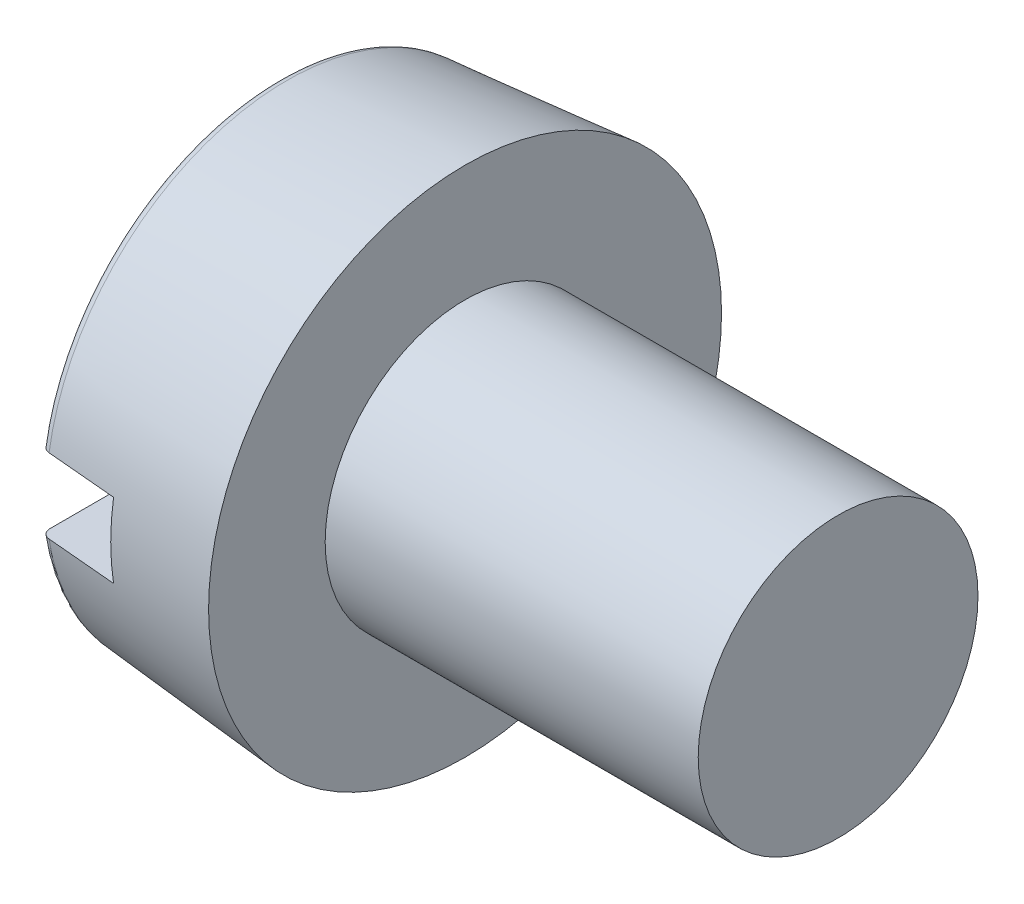
ISO-10303-21;
HEADER;
FILE_DESCRIPTION(('STEP AP214'),'2;1');
FILE_NAME('part.step','',(''),(''),'','','');
FILE_SCHEMA(('AUTOMOTIVE_DESIGN { 1 0 10303 214 1 1 1 1 }'));
ENDSEC;
DATA;
#1=APPLICATION_CONTEXT('core data for automotive mechanical design processes');
#2=APPLICATION_PROTOCOL_DEFINITION('international standard','automotive_design',2000,#1);
#3=PRODUCT_CONTEXT('',#1,'mechanical');
#4=PRODUCT('Part','Part','',(#3));
#5=PRODUCT_RELATED_PRODUCT_CATEGORY('part','',(#4));
#6=PRODUCT_DEFINITION_FORMATION('','',#4);
#7=PRODUCT_DEFINITION_CONTEXT('part definition',#1,'design');
#8=PRODUCT_DEFINITION('design','',#6,#7);
#9=PRODUCT_DEFINITION_SHAPE('','',#8);
#10=(LENGTH_UNIT() NAMED_UNIT(*) SI_UNIT(.MILLI.,.METRE.));
#11=(NAMED_UNIT(*) PLANE_ANGLE_UNIT() SI_UNIT($,.RADIAN.));
#12=(NAMED_UNIT(*) SI_UNIT($,.STERADIAN.) SOLID_ANGLE_UNIT());
#13=UNCERTAINTY_MEASURE_WITH_UNIT(LENGTH_MEASURE(1.E-05),#10,'distance_accuracy_value','');
#14=(GEOMETRIC_REPRESENTATION_CONTEXT(3) GLOBAL_UNCERTAINTY_ASSIGNED_CONTEXT((#13)) GLOBAL_UNIT_ASSIGNED_CONTEXT((#10,
#11,#12)) REPRESENTATION_CONTEXT('',''));
#15=CARTESIAN_POINT('',(0.,0.,0.));
#16=DIRECTION('',(0.,0.,1.));
#17=DIRECTION('',(1.,0.,0.));
#18=AXIS2_PLACEMENT_3D('',#15,#16,#17);
#19=CARTESIAN_POINT('',(0.,0.,0.));
#20=DIRECTION('',(-1.,0.,0.));
#21=DIRECTION('',(0.,0.,0.999999999999999));
#22=AXIS2_PLACEMENT_3D('',#19,#20,#21);
#23=PLANE('',#22);
#24=DIRECTION('',(0.,0.,-0.999999999999999));
#25=VECTOR('',#24,1.);
#26=CARTESIAN_POINT('',(-1.11022302462516E-13,0.399999999999956,2.75000000000025));
#27=LINE('',#26,#25);
#28=CARTESIAN_POINT('',(0.,0.400000000000011,2.45096382768029));
#29=VERTEX_POINT('',#28);
#30=CARTESIAN_POINT('',(0.,0.400000000000122,-2.45096382768017));
#31=VERTEX_POINT('',#30);
#32=EDGE_CURVE('E107',#29,#31,#27,.T.);
#33=ORIENTED_EDGE('',*,*,#32,.F.);
#34=CARTESIAN_POINT('',(0.,0.,0.));
#35=DIRECTION('',(-1.,0.,0.));
#36=DIRECTION('',(0.,0.,0.999999999999999));
#37=AXIS2_PLACEMENT_3D('',#34,#35,#36);
#38=CIRCLE('',#37,2.48338955554641);
#39=EDGE_CURVE('E109',#29,#31,#38,.T.);
#40=ORIENTED_EDGE('',*,*,#39,.T.);
#41=EDGE_LOOP('',(#33,#40));
#42=FACE_BOUND('',#41,.T.);
#43=ADVANCED_FACE('F38',(#42),#23,.T.);
#44=CARTESIAN_POINT('',(0.099999999999878,0.,3.33066907387547E-13));
#45=DIRECTION('',(-1.,0.,0.));
#46=DIRECTION('',(0.,0.,0.999999999999999));
#47=AXIS2_PLACEMENT_3D('',#44,#45,#46);
#48=TOROIDAL_SURFACE('',#47,2.48338955554641,0.1);
#49=CARTESIAN_POINT('',(0.0289938380210741,0.400000000000067,-2.5222831654973));
#50=CARTESIAN_POINT('',(0.0329146400398298,0.400000000000081,-2.52628601737845));
#51=CARTESIAN_POINT('',(0.0371732059087577,0.400000000000074,-2.529963307958));
#52=CARTESIAN_POINT('',(0.0462494374840996,0.400000000000006,-2.53655558833671));
#53=CARTESIAN_POINT('',(0.0510676904570111,0.399999999999945,-2.53946976679739));
#54=CARTESIAN_POINT('',(0.0611266188974277,0.399999999999967,-2.54444525866291));
#55=CARTESIAN_POINT('',(0.0663672780390283,0.400000000000048,-2.54650660501064));
#56=CARTESIAN_POINT('',(0.0771205298537021,0.400000000000031,-2.54971287140381));
#57=CARTESIAN_POINT('',(0.0826330564249424,0.399999999999932,-2.55085801306036));
#58=CARTESIAN_POINT('',(0.0937360108303437,0.399999999999924,-2.5521931808088));
#59=CARTESIAN_POINT('',(0.0993256947508822,0.400000000000013,-2.55238939597446));
#60=CARTESIAN_POINT('',(0.110458306622029,0.400000000000066,-2.55183747649989));
#61=CARTESIAN_POINT('',(0.116001234198346,0.400000000000029,-2.55108933430717));
#62=CARTESIAN_POINT('',(0.12686581978364,0.399999999999994,-2.54867516285264));
#63=CARTESIAN_POINT('',(0.132188090846989,0.399999999999994,-2.54701188972763));
#64=CARTESIAN_POINT('',(0.142479668135659,0.400000000000085,-2.54281935144428));
#65=CARTESIAN_POINT('',(0.147448970444538,0.400000000000176,-2.54029007667883));
#66=CARTESIAN_POINT('',(0.156919019556877,0.40000000000018,-2.5344269956783));
#67=CARTESIAN_POINT('',(0.161417530686832,0.400000000000093,-2.53108957986557));
#68=CARTESIAN_POINT('',(0.169797583318704,0.399999999999987,-2.52371398467361));
#69=CARTESIAN_POINT('',(0.173679096427605,0.399999999999968,-2.51967577306305));
#70=CARTESIAN_POINT('',(0.180758379631812,0.4,-2.51096934806661));
#71=CARTESIAN_POINT('',(0.183948691710205,0.400000000000051,-2.50629507144577));
#72=CARTESIAN_POINT('',(0.189510239570531,0.400000000000029,-2.49648236653689));
#73=CARTESIAN_POINT('',(0.191881421883535,0.399999999999956,-2.49134390797686));
#74=CARTESIAN_POINT('',(0.195767027940503,0.399999999999956,-2.48068220520699));
#75=CARTESIAN_POINT('',(0.197270760971725,0.40000000000003,-2.47515506403461));
#76=CARTESIAN_POINT('',(0.19933812835327,0.400000000000049,-2.46392763420007));
#77=CARTESIAN_POINT('',(0.199901709526113,0.399999999999994,-2.45822733576225));
#78=CARTESIAN_POINT('',(0.200075481339008,0.399999999999973,-2.44676112412225));
#79=CARTESIAN_POINT('',(0.199677113345834,0.400000000000008,-2.44099507954669));
#80=CARTESIAN_POINT('',(0.197919889661652,0.400000000000072,-2.4296110913812));
#81=CARTESIAN_POINT('',(0.196561010768111,0.400000000000101,-2.42399315137234));
#82=CARTESIAN_POINT('',(0.192915627153946,0.400000000000089,-2.4130559056582));
#83=CARTESIAN_POINT('',(0.190627555523889,0.400000000000047,-2.40773712175808));
#84=CARTESIAN_POINT('',(0.185185000915753,0.400000000000032,-2.39756279520348));
#85=CARTESIAN_POINT('',(0.18203054003551,0.400000000000059,-2.39270724073827));
#86=CARTESIAN_POINT('',(0.174965864483055,0.400000000000075,-2.38363467595357));
#87=CARTESIAN_POINT('',(0.171060998294482,0.400000000000065,-2.37941350258342));
#88=CARTESIAN_POINT('',(0.162589830789187,0.400000000000015,-2.37169707517604));
#89=CARTESIAN_POINT('',(0.158023574903172,0.399999999999975,-2.3682017713191));
#90=CARTESIAN_POINT('',(0.148421596079095,0.399999999999992,-2.36208459946192));
#91=CARTESIAN_POINT('',(0.143392636404695,0.400000000000047,-2.35945211619921));
#92=CARTESIAN_POINT('',(0.132960042691397,0.400000000000032,-2.35508144798942));
#93=CARTESIAN_POINT('',(0.127556438263652,0.399999999999961,-2.35334319245564));
#94=CARTESIAN_POINT('',(0.116602502745181,0.399999999999951,-2.35083201602062));
#95=CARTESIAN_POINT('',(0.111054942498121,0.40000000000001,-2.35004699968925));
#96=CARTESIAN_POINT('',(0.0999070705253393,0.40000000000007,-2.3494263065426));
#97=CARTESIAN_POINT('',(0.0943067613611182,0.400000000000071,-2.34959058386426));
#98=CARTESIAN_POINT('',(0.0832511443148624,0.400000000000063,-2.35085902950951));
#99=CARTESIAN_POINT('',(0.0777951256898229,0.400000000000054,-2.3519570180142));
#100=CARTESIAN_POINT('',(0.0671440893671571,0.400000000000026,-2.35505088710252));
#101=CARTESIAN_POINT('',(0.0619490721184901,0.400000000000006,-2.3570467692306));
#102=CARTESIAN_POINT('',(0.0519500535749942,0.400000000000017,-2.36188301447882));
#103=CARTESIAN_POINT('',(0.047147218207613,0.400000000000048,-2.3647257866422));
#104=CARTESIAN_POINT('',(0.0380802947550637,0.400000000000032,-2.3711691777194));
#105=CARTESIAN_POINT('',(0.0338162339656834,0.399999999999984,-2.37476983500514));
#106=CARTESIAN_POINT('',(0.0258978392798543,0.399999999999983,-2.3826673094212));
#107=CARTESIAN_POINT('',(0.0222505790302912,0.40000000000003,-2.38697121737438));
#108=CARTESIAN_POINT('',(0.0157188388684685,0.40000000000005,-2.3961233337754));
#109=CARTESIAN_POINT('',(0.0128344147286653,0.400000000000023,-2.40097158198413));
#110=CARTESIAN_POINT('',(0.00786953684593799,0.4,-2.411145185956));
#111=CARTESIAN_POINT('',(0.00580049504419321,0.400000000000003,-2.4164761118895));
#112=CARTESIAN_POINT('',(0.00257668282217933,0.400000000000077,-2.42740741369921));
#113=CARTESIAN_POINT('',(0.00142193421220788,0.400000000000146,-2.43300779599987));
#114=CARTESIAN_POINT('',(4.98309082298282E-05,0.400000000000154,-2.44437919860998));
#115=CARTESIAN_POINT('',(-0.000158040155085147,0.400000000000091,-2.45015136490805));
#116=CARTESIAN_POINT('',(0.000395629680232976,0.399999999999989,-2.4616507024947));
#117=CARTESIAN_POINT('',(0.00115743264874176,0.399999999999951,-2.46737786119829));
#118=CARTESIAN_POINT('',(0.00363465605125898,0.399999999999961,-2.47863907342404));
#119=CARTESIAN_POINT('',(0.00535281370349718,0.40000000000001,-2.48417252398618));
#120=CARTESIAN_POINT('',(0.0096985066924305,0.40000000000007,-2.49486489969048));
#121=CARTESIAN_POINT('',(0.0123249394517729,0.40000000000008,-2.50002426979413));
#122=CARTESIAN_POINT('',(0.0173136943958683,0.400000000000058,-2.50805181152165));
#123=CARTESIAN_POINT('',(0.0194300826405273,0.40000000000004,-2.5110756102563));
#124=CARTESIAN_POINT('',(0.0239801784125076,0.40000000000004,-2.51687431501096));
#125=CARTESIAN_POINT('',(0.0264138847051317,0.400000000000058,-2.51964922199936));
#126=CARTESIAN_POINT('',(0.0289938380210741,0.400000000000067,-2.5222831654973));
#127=B_SPLINE_CURVE_WITH_KNOTS('',3,(#49,#50,#51,#52,#53,#54,#55,#56,#57,#58,#59,#60,#61,#62,
#63,#64,#65,#66,#67,#68,#69,#70,#71,#72,#73,#74,#75,#76,#77,#78,#79,#80,#81,#82,#83,#84,#85,#86,
#87,#88,#89,#90,#91,#92,#93,#94,#95,#96,#97,#98,#99,#100,#101,#102,#103,#104,#105,#106,#107,
#108,#109,#110,#111,#112,#113,#114,#115,#116,#117,#118,#119,#120,#121,#122,#123,#124,#125,#126),
.UNSPECIFIED.,.T.,.F.,(4,2,2,2,2,2,2,2,2,2,2,2,2,2,2,2,2,2,2,2,2,2,2,2,2,2,2,2,2,2,2,2,2,2,2,2,
2,2,4),(0.,0.0167962438772085,0.0336102736231155,0.0504236538218384,0.067232965978634,
0.0839324954658057,0.100632158508273,0.117281799647361,0.133931625497359,0.150657236215137,
0.167383616389428,0.184282358747677,0.201182203967847,0.218286107817113,0.235390979075716,
0.252648595290889,0.26990662840305,0.287193885606301,0.304480701927451,0.321648593971738,
0.33881530731617,0.35576211254693,0.37270757986049,0.389435704571949,0.40616302110713,
0.422780481006435,0.439397969489136,0.456063186523245,0.472729247524401,0.489575093863047,
0.506422171494554,0.523497308438608,0.540572852694674,0.557819049576697,0.575069908508373,
0.592370397549168,0.60964995839933,0.62070221084339,0.631754420283982),.UNSPECIFIED.);
#128=CARTESIAN_POINT('',(0.0912844257252299,0.400000000000011,-2.55184945188125));
#129=VERTEX_POINT('',#128);
#130=EDGE_CURVE('E62',#31,#129,#127,.T.);
#131=ORIENTED_EDGE('',*,*,#130,.F.);
#132=ORIENTED_EDGE('',*,*,#39,.F.);
#133=CARTESIAN_POINT('',(0.0367676987022003,0.400000000000067,2.37243473528737));
#134=CARTESIAN_POINT('',(0.0410691072562753,0.400000000000085,2.36887462682059));
#135=CARTESIAN_POINT('',(0.0456712476147304,0.400000000000053,2.36567202074331));
#136=CARTESIAN_POINT('',(0.0553504912179236,0.400000000000027,2.36008032650201));
#137=CARTESIAN_POINT('',(0.0604280839550336,0.400000000000034,2.35769208875698));
#138=CARTESIAN_POINT('',(0.0709135886902994,0.400000000000045,2.35380489827384));
#139=CARTESIAN_POINT('',(0.0763214938191946,0.400000000000048,2.35230592704925));
#140=CARTESIAN_POINT('',(0.0873116719417733,0.400000000000031,2.35024450872403));
#141=CARTESIAN_POINT('',(0.0928939027986491,0.400000000000011,2.34968183706544));
#142=CARTESIAN_POINT('',(0.104036601297543,0.400000000000012,2.34951039508079));
#143=CARTESIAN_POINT('',(0.109596974662392,0.400000000000034,2.34989545024105));
#144=CARTESIAN_POINT('',(0.120573920357243,0.400000000000046,2.35159460899422));
#145=CARTESIAN_POINT('',(0.125990490202792,0.400000000000035,2.35290872862749));
#146=CARTESIAN_POINT('',(0.136522391247393,0.400000000000043,2.35642416504586));
#147=CARTESIAN_POINT('',(0.141637967614948,0.400000000000061,2.35862474798485));
#148=CARTESIAN_POINT('',(0.151431222534123,0.400000000000019,2.36384674458554));
#149=CARTESIAN_POINT('',(0.156108887375849,0.399999999999958,2.36686818393463));
#150=CARTESIAN_POINT('',(0.164936002938741,0.399999999999954,2.37367095441));
#151=CARTESIAN_POINT('',(0.169080793893265,0.40000000000001,2.37745832978694));
#152=CARTESIAN_POINT('',(0.176685910750803,0.40000000000007,2.38566704388071));
#153=CARTESIAN_POINT('',(0.180146192360974,0.400000000000073,2.39008842359043));
#154=CARTESIAN_POINT('',(0.186332746435601,0.400000000000061,2.39950205527764));
#155=CARTESIAN_POINT('',(0.189048713902095,0.400000000000046,2.40450107962622));
#156=CARTESIAN_POINT('',(0.193614409892966,0.400000000000033,2.41488017557647));
#157=CARTESIAN_POINT('',(0.195464077650918,0.400000000000034,2.42026027387804));
#158=CARTESIAN_POINT('',(0.198266231334813,0.400000000000044,2.43131856240115));
#159=CARTESIAN_POINT('',(0.199207620171128,0.400000000000052,2.43699956654949));
#160=CARTESIAN_POINT('',(0.200129256919687,0.400000000000027,2.44843911280629));
#161=CARTESIAN_POINT('',(0.200109464431539,0.399999999999994,2.45419765816379));
#162=CARTESIAN_POINT('',(0.199105792419053,0.399999999999974,2.46566309979128));
#163=CARTESIAN_POINT('',(0.198116473192238,0.399999999999988,2.47136952123478));
#164=CARTESIAN_POINT('',(0.195191128966275,0.400000000000092,2.4825344956542));
#165=CARTESIAN_POINT('',(0.193255106776895,0.400000000000182,2.48799304936573));
#166=CARTESIAN_POINT('',(0.18849467527847,0.400000000000174,2.49848893070258));
#167=CARTESIAN_POINT('',(0.18567288095153,0.400000000000077,2.5035274436635));
#168=CARTESIAN_POINT('',(0.179215498557306,0.400000000000003,2.51305299197645));
#169=CARTESIAN_POINT('',(0.175579948629181,0.400000000000026,2.5175400531587));
#170=CARTESIAN_POINT('',(0.167635478825404,0.400000000000053,2.52578731588135));
#171=CARTESIAN_POINT('',(0.163333512373987,0.400000000000057,2.52955421420507));
#172=CARTESIAN_POINT('',(0.154151555490135,0.400000000000023,2.53630156216183));
#173=CARTESIAN_POINT('',(0.149271604711215,0.399999999999985,2.53928206570149));
#174=CARTESIAN_POINT('',(0.139136353071224,0.399999999999983,2.54433379308571));
#175=CARTESIAN_POINT('',(0.13388636911297,0.400000000000017,2.54641568563792));
#176=CARTESIAN_POINT('',(0.123109394747447,0.400000000000063,2.5496589322558));
#177=CARTESIAN_POINT('',(0.117582421034118,0.400000000000073,2.55082034172745));
#178=CARTESIAN_POINT('',(0.106464698916032,0.400000000000061,2.55218028189346));
#179=CARTESIAN_POINT('',(0.100875054594288,0.400000000000038,2.55238785185265));
#180=CARTESIAN_POINT('',(0.0897407847209932,0.400000000000041,2.55185843737986));
#181=CARTESIAN_POINT('',(0.0841961579349503,0.400000000000067,2.55112147893784));
#182=CARTESIAN_POINT('',(0.07332656572669,0.400000000000067,2.54872918263983));
#183=CARTESIAN_POINT('',(0.0680009847336716,0.400000000000042,2.54707663871159));
#184=CARTESIAN_POINT('',(0.0577010526377098,0.400000000000038,2.54290481605169));
#185=CARTESIAN_POINT('',(0.0527267057043604,0.400000000000059,2.54038552703276));
#186=CARTESIAN_POINT('',(0.0432451955153454,0.400000000000075,2.53454156724992));
#187=CARTESIAN_POINT('',(0.03874023894787,0.400000000000072,2.53121331773277));
#188=CARTESIAN_POINT('',(0.0303458654215818,0.400000000000008,2.52385482922198));
#189=CARTESIAN_POINT('',(0.0264564786942172,0.399999999999949,2.51982455577141));
#190=CARTESIAN_POINT('',(0.0193602742266783,0.399999999999963,2.51113277232478));
#191=CARTESIAN_POINT('',(0.0161608831051457,0.400000000000038,2.50646520000345));
#192=CARTESIAN_POINT('',(0.0105801862775686,0.400000000000042,2.49666430232799));
#193=CARTESIAN_POINT('',(0.0081989347764327,0.399999999999972,2.49153094614234));
#194=CARTESIAN_POINT('',(0.00429230007901448,0.39999999999994,2.48087765570907));
#195=CARTESIAN_POINT('',(0.00277761888647858,0.399999999999978,2.47535379620031));
#196=CARTESIAN_POINT('',(0.000687995440409238,0.400000000000102,2.46413127035634));
#197=CARTESIAN_POINT('',(0.000113070892116207,0.400000000000187,2.45843260072971));
#198=CARTESIAN_POINT('',(-8.37002456627473E-05,0.400000000000169,2.44696818040158));
#199=CARTESIAN_POINT('',(0.000302941335658921,0.400000000000066,2.44120228266172));
#200=CARTESIAN_POINT('',(0.00203701001725242,0.400000000000015,2.4298150820762));
#201=CARTESIAN_POINT('',(0.00338469494753199,0.400000000000068,2.42419381845256));
#202=CARTESIAN_POINT('',(0.00700896577895075,0.400000000000066,2.41324562761794));
#203=CARTESIAN_POINT('',(0.00928760515717935,0.400000000000012,2.4079193808315));
#204=CARTESIAN_POINT('',(0.0147114792185534,0.400000000000068,2.39773348978119));
#205=CARTESIAN_POINT('',(0.0178556585514987,0.400000000000177,2.39287328694013));
#206=CARTESIAN_POINT('',(0.0236503626604496,0.400000000000133,2.38539954815924));
#207=CARTESIAN_POINT('',(0.0260726096208682,0.400000000000059,2.38260604033163));
#208=CARTESIAN_POINT('',(0.0312086078085989,0.40000000000002,2.37730112356015));
#209=CARTESIAN_POINT('',(0.0339223576900445,0.400000000000055,2.37478971331396));
#210=CARTESIAN_POINT('',(0.0367676987022003,0.400000000000067,2.37243473528737));
#211=B_SPLINE_CURVE_WITH_KNOTS('',3,(#133,#134,#135,#136,#137,#138,#139,#140,#141,#142,#143,
#144,#145,#146,#147,#148,#149,#150,#151,#152,#153,#154,#155,#156,#157,#158,#159,#160,#161,#162,
#163,#164,#165,#166,#167,#168,#169,#170,#171,#172,#173,#174,#175,#176,#177,#178,#179,#180,#181,
#182,#183,#184,#185,#186,#187,#188,#189,#190,#191,#192,#193,#194,#195,#196,#197,#198,#199,#200,
#201,#202,#203,#204,#205,#206,#207,#208,#209,#210),.UNSPECIFIED.,.T.,.F.,(4,2,2,2,2,2,2,2,2,2,2,
2,2,2,2,2,2,2,2,2,2,2,2,2,2,2,2,2,2,2,2,2,2,2,2,2,2,2,4),(0.,0.0167374978405915,
0.0334924209722681,0.0502469957828506,0.0669975516707378,0.0836392656128318,0.100281266882229,
0.116909519525499,0.133538292583026,0.150303803185587,0.167070398286702,0.184058579715736,
0.201047952599047,0.218242362612866,0.23543749534309,0.252729660021643,0.270021773378215,
0.287263309496155,0.3045040377056,0.321575685445969,0.33864616263705,0.355507989950268,
0.372368802234569,0.389069495340024,0.405769728913596,0.422419279849056,0.439069028402588,
0.45579381890774,0.472519430534747,0.489416954805275,0.506315598386239,0.523418666684245,
0.540522057204443,0.55777696190293,0.575036497512961,0.592334311120763,0.609611126268751,
0.620682873655369,0.631754569926022),.UNSPECIFIED.);
#212=CARTESIAN_POINT('',(0.091284425724425,0.400000000000011,2.55184945188525));
#213=VERTEX_POINT('',#212);
#214=EDGE_CURVE('E99',#213,#29,#211,.T.);
#215=ORIENTED_EDGE('',*,*,#214,.F.);
#216=CARTESIAN_POINT('',(0.0912844257250911,0.,0.));
#217=DIRECTION('',(-1.,0.,0.));
#218=DIRECTION('',(0.,0.,0.999999999999999));
#219=AXIS2_PLACEMENT_3D('',#216,#217,#218);
#220=CIRCLE('',#219,2.58300902535558);
#221=EDGE_CURVE('E113',#129,#213,#220,.F.);
#222=ORIENTED_EDGE('',*,*,#221,.F.);
#223=EDGE_LOOP('',(#131,#132,#215,#222));
#224=FACE_BOUND('',#223,.T.);
#225=ADVANCED_FACE('F184',(#224),#48,.T.);
#226=CARTESIAN_POINT('',(-25.4,0.,0.));
#227=DIRECTION('',(-1.,0.,0.));
#228=DIRECTION('',(0.,0.,0.999999999999999));
#229=AXIS2_PLACEMENT_3D('',#226,#227,#228);
#230=CYLINDRICAL_SURFACE('',#229,1.5);
#231=CARTESIAN_POINT('',(5.99999999999989,0.,0.));
#232=DIRECTION('',(-1.,0.,0.));
#233=DIRECTION('',(0.,0.,0.999999999999999));
#234=AXIS2_PLACEMENT_3D('',#231,#232,#233);
#235=CIRCLE('',#234,1.5);
#236=CARTESIAN_POINT('',(5.99999999999989,0.,1.5));
#237=VERTEX_POINT('',#236);
#238=EDGE_CURVE('E110',#237,#237,#235,.T.);
#239=ORIENTED_EDGE('',*,*,#238,.T.);
#240=EDGE_LOOP('',(#239));
#241=FACE_BOUND('',#240,.T.);
#242=CARTESIAN_POINT('',(1.99999999999995,0.,2.22044604925031E-13));
#243=DIRECTION('',(-1.,0.,0.));
#244=DIRECTION('',(0.,0.,0.999999999999999));
#245=AXIS2_PLACEMENT_3D('',#242,#243,#244);
#246=CIRCLE('',#245,1.5);
#247=CARTESIAN_POINT('',(1.99999999999995,0.,1.50000000000022));
#248=VERTEX_POINT('',#247);
#249=EDGE_CURVE('E171',#248,#248,#246,.T.);
#250=ORIENTED_EDGE('',*,*,#249,.F.);
#251=EDGE_LOOP('',(#250));
#252=FACE_BOUND('',#251,.T.);
#253=ADVANCED_FACE('F181',(#241,#252),#230,.T.);
#254=CARTESIAN_POINT('',(5.99999999999995,1.5,0.));
#255=DIRECTION('',(1.,0.,0.));
#256=DIRECTION('',(0.,0.,-0.999999999999999));
#257=AXIS2_PLACEMENT_3D('',#254,#255,#256);
#258=PLANE('',#257);
#259=ORIENTED_EDGE('',*,*,#238,.F.);
#260=EDGE_LOOP('',(#259));
#261=FACE_BOUND('',#260,.T.);
#262=ADVANCED_FACE('F183',(#261),#258,.T.);
#263=DIRECTION('',(0.,0.,0.999999999999999));
#264=VECTOR('',#263,1.);
#265=CARTESIAN_POINT('',(-1.11022302462516E-13,-0.400000000000011,-2.74999999999959));
#266=LINE('',#265,#264);
#267=CARTESIAN_POINT('',(0.,-0.399999999999956,-2.45096382767995));
#268=VERTEX_POINT('',#267);
#269=CARTESIAN_POINT('',(0.,-0.399999999999734,2.45096382768073));
#270=VERTEX_POINT('',#269);
#271=EDGE_CURVE('E54',#268,#270,#266,.T.);
#272=ORIENTED_EDGE('',*,*,#271,.F.);
#273=EDGE_CURVE('E105',#268,#270,#38,.T.);
#274=ORIENTED_EDGE('',*,*,#273,.T.);
#275=EDGE_LOOP('',(#272,#274));
#276=FACE_BOUND('',#275,.T.);
#277=ADVANCED_FACE('F104',(#276),#23,.T.);
#278=CARTESIAN_POINT('',(0.,0.,0.));
#279=DIRECTION('',(1.,0.,0.));
#280=DIRECTION('',(0.,0.,-0.999999999999999));
#281=AXIS2_PLACEMENT_3D('',#278,#279,#280);
#282=CONICAL_SURFACE('',#281,2.57502267294815,0.0872664625997168);
#283=CARTESIAN_POINT('',(-4.36225986914576,0.399999999999928,-2.15659249783995));
#284=CARTESIAN_POINT('',(-3.02252879329915,0.400000000000355,-2.27578971400859));
#285=CARTESIAN_POINT('',(-1.68277158070821,0.400000000000311,-2.39469248552486));
#286=CARTESIAN_POINT('',(-0.0871929715729305,0.400000000000153,-2.53604555798361));
#287=CARTESIAN_POINT('',(0.168610376643239,0.400000000000124,-2.55869953286878));
#288=CARTESIAN_POINT('',(2.02000114161492,0.399999999999912,-2.72260692865456));
#289=CARTESIAN_POINT('',(3.61561248830942,0.399999999999707,-2.86359016849075));
#290=CARTESIAN_POINT('',(5.21123588736547,0.400000000000122,-3.00443640584791));
#291=B_SPLINE_CURVE_WITH_KNOTS('',3,(#283,#284,#285,#286,#287,#288,#289,#290),.UNSPECIFIED.,.F.,
.F.,(4,2,2,4),(0.,4.03506939923902,4.80548292410965,9.61096578658459),.UNSPECIFIED.);
#292=CARTESIAN_POINT('',(0.849999999999906,0.400000000000067,-2.61901832187328));
#293=VERTEX_POINT('',#292);
#294=EDGE_CURVE('E166',#129,#293,#291,.T.);
#295=ORIENTED_EDGE('',*,*,#294,.F.);
#296=ORIENTED_EDGE('',*,*,#221,.T.);
#297=CARTESIAN_POINT('',(5.2112358873655,0.400000000000067,3.00443640584824));
#298=CARTESIAN_POINT('',(4.4134235869623,0.400000000000142,2.93401988873179));
#299=CARTESIAN_POINT('',(3.61561486907639,0.400000000000099,2.86356274948062));
#300=CARTESIAN_POINT('',(2.02000692465128,0.399999999999976,2.72254136292339));
#301=CARTESIAN_POINT('',(1.22220769811179,0.399999999999897,2.65197711562059));
#302=CARTESIAN_POINT('',(-0.373378996688707,0.399999999999904,2.51071564393385));
#303=CARTESIAN_POINT('',(-1.17116646494956,0.399999999999989,2.4400184195481));
#304=CARTESIAN_POINT('',(-2.76672581923321,0.400000000000094,2.29844809218183));
#305=CARTESIAN_POINT('',(-3.56449770525552,0.400000000000113,2.22757498919592));
#306=CARTESIAN_POINT('',(-4.36225986914573,0.399999999999984,2.15659249784006));
#307=B_SPLINE_CURVE_WITH_KNOTS('',3,(#297,#298,#299,#300,#301,#302,#303,#304,#305,#306),
.UNSPECIFIED.,.F.,.F.,(4,2,2,2,4),(0.,2.40274147318221,4.80548287330217,7.20822430613125,
9.61096581263783),.UNSPECIFIED.);
#308=CARTESIAN_POINT('',(0.849999999999934,0.400000000000122,2.6190183218735));
#309=VERTEX_POINT('',#308);
#310=EDGE_CURVE('E162',#309,#213,#307,.T.);
#311=ORIENTED_EDGE('',*,*,#310,.F.);
#312=CARTESIAN_POINT('',(0.849999999999962,0.,3.33066907387547E-13));
#313=DIRECTION('',(-1.,0.,0.));
#314=DIRECTION('',(0.,0.,0.999999999999999));
#315=AXIS2_PLACEMENT_3D('',#312,#313,#314);
#316=CIRCLE('',#315,2.64938803694519);
#317=CARTESIAN_POINT('',(0.849999999999962,-0.400000000000011,2.61901832187339));
#318=VERTEX_POINT('',#317);
#319=EDGE_CURVE('E43',#309,#318,#316,.F.);
#320=ORIENTED_EDGE('',*,*,#319,.T.);
#321=CARTESIAN_POINT('',(-4.36225986914585,-0.399999999999956,2.15659249783995));
#322=CARTESIAN_POINT('',(-3.02252879329928,-0.399999999999887,2.27578971400893));
#323=CARTESIAN_POINT('',(-1.68277158070832,-0.399999999999934,2.3946924855253));
#324=CARTESIAN_POINT('',(-0.0871929715730227,-0.399999999999993,2.53604555798406));
#325=CARTESIAN_POINT('',(0.168610376643165,-0.400000000000003,2.55869953286923));
#326=CARTESIAN_POINT('',(2.02000114161483,-0.400000000000066,2.72260692865498));
#327=CARTESIAN_POINT('',(3.61561248830928,-0.400000000000094,2.86359016849104));
#328=CARTESIAN_POINT('',(5.21123588736533,-0.3999999999999,3.00443640584824));
#329=B_SPLINE_CURVE_WITH_KNOTS('',3,(#321,#322,#323,#324,#325,#326,#327,#328),.UNSPECIFIED.,.F.,
.F.,(4,2,2,4),(0.,4.03506939923903,4.80548292410972,9.61096578658457),.UNSPECIFIED.);
#330=CARTESIAN_POINT('',(0.0912844257240364,-0.399999999999956,2.55184945188203));
#331=VERTEX_POINT('',#330);
#332=EDGE_CURVE('E140',#331,#318,#329,.T.);
#333=ORIENTED_EDGE('',*,*,#332,.F.);
#334=CARTESIAN_POINT('',(0.0912844257451861,-0.399999999999984,-2.55184945199793));
#335=VERTEX_POINT('',#334);
#336=EDGE_CURVE('E119',#331,#335,#220,.F.);
#337=ORIENTED_EDGE('',*,*,#336,.T.);
#338=CARTESIAN_POINT('',(5.21123588736527,-0.400000000000011,-3.00443640584791));
#339=CARTESIAN_POINT('',(4.41342358696203,-0.399999999999957,-2.93401988873226));
#340=CARTESIAN_POINT('',(3.61561486907616,-0.399999999999951,-2.86356274948096));
#341=CARTESIAN_POINT('',(2.02000692465117,-0.399999999999965,-2.72254136292305));
#342=CARTESIAN_POINT('',(1.22220769811176,-0.399999999999985,-2.6519771156197));
#343=CARTESIAN_POINT('',(-0.373378996688695,-0.399999999999983,-2.51071564393296));
#344=CARTESIAN_POINT('',(-1.17116646494958,-0.399999999999961,-2.44001841954774));
#345=CARTESIAN_POINT('',(-2.76672581923327,-0.399999999999946,-2.2984480921822));
#346=CARTESIAN_POINT('',(-3.56449770525559,-0.399999999999953,-2.22757498919649));
#347=CARTESIAN_POINT('',(-4.36225986914573,-0.400000000000011,-2.15659249783995));
#348=B_SPLINE_CURVE_WITH_KNOTS('',3,(#338,#339,#340,#341,#342,#343,#344,#345,#346,#347),
.UNSPECIFIED.,.F.,.F.,(4,2,2,2,4),(0.,2.40274147318212,4.805482873302,7.20822430613104,
9.61096581263759),.UNSPECIFIED.);
#349=CARTESIAN_POINT('',(0.849999999999906,-0.399999999999956,-2.61901832187295));
#350=VERTEX_POINT('',#349);
#351=EDGE_CURVE('E94',#350,#335,#348,.T.);
#352=ORIENTED_EDGE('',*,*,#351,.F.);
#353=EDGE_CURVE('E11',#350,#293,#316,.F.);
#354=ORIENTED_EDGE('',*,*,#353,.T.);
#355=EDGE_LOOP('',(#295,#296,#311,#320,#333,#337,#352,#354));
#356=FACE_BOUND('',#355,.T.);
#357=CARTESIAN_POINT('',(1.99999999999995,0.,2.22044604925031E-13));
#358=DIRECTION('',(-1.,0.,0.));
#359=DIRECTION('',(0.,0.,0.999999999999999));
#360=AXIS2_PLACEMENT_3D('',#357,#358,#359);
#361=CIRCLE('',#360,2.75);
#362=CARTESIAN_POINT('',(1.99999999999995,0.,2.75000000000022));
#363=VERTEX_POINT('',#362);
#364=EDGE_CURVE('E115',#363,#363,#361,.T.);
#365=ORIENTED_EDGE('',*,*,#364,.T.);
#366=EDGE_LOOP('',(#365));
#367=FACE_BOUND('',#366,.T.);
#368=ADVANCED_FACE('F151',(#356,#367),#282,.T.);
#369=CARTESIAN_POINT('',(1.99999999999995,1.50000000000011,4.44089209850063E-13));
#370=DIRECTION('',(-1.,0.,0.));
#371=DIRECTION('',(0.,0.,0.999999999999999));
#372=AXIS2_PLACEMENT_3D('',#369,#370,#371);
#373=PLANE('',#372);
#374=ORIENTED_EDGE('',*,*,#364,.F.);
#375=EDGE_LOOP('',(#374));
#376=FACE_BOUND('',#375,.T.);
#377=ORIENTED_EDGE('',*,*,#249,.T.);
#378=EDGE_LOOP('',(#377));
#379=FACE_BOUND('',#378,.T.);
#380=ADVANCED_FACE('F155',(#376,#379),#373,.F.);
#381=CARTESIAN_POINT('',(0.0289938380211019,-0.3999999999999,-2.52228316549763));
#382=CARTESIAN_POINT('',(0.0250040691258162,-0.39999999999989,-2.51820918183003));
#383=CARTESIAN_POINT('',(0.0213583190111716,-0.399999999999929,-2.51379201367188));
#384=CARTESIAN_POINT('',(0.0148592785644811,-0.399999999999981,-2.50440306026744));
#385=CARTESIAN_POINT('',(0.0120070700797257,-0.399999999999994,-2.49943053069808));
#386=CARTESIAN_POINT('',(0.00717770347927565,-0.399999999999973,-2.48908271582247));
#387=CARTESIAN_POINT('',(0.00519971746689477,-0.399999999999939,-2.48370781722987));
#388=CARTESIAN_POINT('',(0.00216717495660803,-0.399999999999971,-2.47270542437934));
#389=CARTESIAN_POINT('',(0.00111238322133321,-0.400000000000038,-2.46707799485275));
#390=CARTESIAN_POINT('',(-5.25582060038122E-05,-0.400000000000041,-2.45568286085497));
#391=CARTESIAN_POINT('',(-0.000155467825546804,-0.399999999999976,-2.44991441534203));
#392=CARTESIAN_POINT('',(0.000604499958873644,-0.399999999999934,-2.43844109806126));
#393=CARTESIAN_POINT('',(0.0014674533640545,-0.399999999999958,-2.43273623133195));
#394=CARTESIAN_POINT('',(0.00414151157253415,-0.399999999999954,-2.42152987250566));
#395=CARTESIAN_POINT('',(0.00595623339037458,-0.399999999999927,-2.41602924255929));
#396=CARTESIAN_POINT('',(0.0104876390059047,-0.399999999999983,-2.40541275972359));
#397=CARTESIAN_POINT('',(0.0132043099999359,-0.400000000000066,-2.40029690137348));
#398=CARTESIAN_POINT('',(0.01945124936087,-0.400000000000068,-2.39062289289003));
#399=CARTESIAN_POINT('',(0.0229775960030237,-0.399999999999987,-2.38606221159103));
#400=CARTESIAN_POINT('',(0.0307542280704633,-0.399999999999923,-2.37760643337957));
#401=CARTESIAN_POINT('',(0.0350044686960174,-0.399999999999939,-2.3737112953084));
#402=CARTESIAN_POINT('',(0.0440555019554921,-0.399999999999972,-2.36674703965385));
#403=CARTESIAN_POINT('',(0.0488492409467562,-0.399999999999989,-2.36366875652146));
#404=CARTESIAN_POINT('',(0.0588909820214949,-0.399999999999921,-2.3583735233013));
#405=CARTESIAN_POINT('',(0.0641389481440919,-0.399999999999836,-2.35615650510385));
#406=CARTESIAN_POINT('',(0.0748640783279455,-0.399999999999854,-2.35267719664878));
#407=CARTESIAN_POINT('',(0.080337200992819,-0.399999999999955,-2.35140244386443));
#408=CARTESIAN_POINT('',(0.091420226444753,-0.399999999999956,-2.34979886853986));
#409=CARTESIAN_POINT('',(0.0970301209942985,-0.399999999999857,-2.34946998917267));
#410=CARTESIAN_POINT('',(0.108175670502392,-0.399999999999833,-2.34976708273953));
#411=CARTESIAN_POINT('',(0.113711547505793,-0.399999999999908,-2.35038480500911));
#412=CARTESIAN_POINT('',(0.124600906547832,-0.400000000000002,-2.35254069219912));
#413=CARTESIAN_POINT('',(0.129954390579096,-0.400000000000022,-2.35407884706051));
#414=CARTESIAN_POINT('',(0.14033056247832,-0.400000000000001,-2.35802931008483));
#415=CARTESIAN_POINT('',(0.145353122327557,-0.39999999999996,-2.3604419542265));
#416=CARTESIAN_POINT('',(0.154926879209696,-0.399999999999951,-2.3660688893784));
#417=CARTESIAN_POINT('',(0.159478058010426,-0.399999999999982,-2.36928321137972));
#418=CARTESIAN_POINT('',(0.168025501299975,-0.399999999999985,-2.37645214423974));
#419=CARTESIAN_POINT('',(0.172016319852367,-0.399999999999955,-2.38041324620982));
#420=CARTESIAN_POINT('',(0.179287042308508,-0.399999999999955,-2.38894140410132));
#421=CARTESIAN_POINT('',(0.182566897622774,-0.399999999999985,-2.39350850140401));
#422=CARTESIAN_POINT('',(0.188369159015874,-0.399999999999982,-2.40318459258679));
#423=CARTESIAN_POINT('',(0.190880811711597,-0.399999999999948,-2.40830003507245));
#424=CARTESIAN_POINT('',(0.195020891957927,-0.399999999999963,-2.41887665144672));
#425=CARTESIAN_POINT('',(0.196649260076576,-0.400000000000012,-2.42433784857189));
#426=CARTESIAN_POINT('',(0.198994072160055,-0.400000000000011,-2.43551846416639));
#427=CARTESIAN_POINT('',(0.199699802934799,-0.399999999999961,-2.44124013143324));
#428=CARTESIAN_POINT('',(0.200145599532793,-0.399999999999949,-2.45272108096219));
#429=CARTESIAN_POINT('',(0.199885628830424,-0.399999999999987,-2.45848036463882));
#430=CARTESIAN_POINT('',(0.198402716236416,-0.39999999999998,-2.46990089334096));
#431=CARTESIAN_POINT('',(0.197175332540472,-0.399999999999935,-2.47556156274721));
#432=CARTESIAN_POINT('',(0.193783964811682,-0.399999999999976,-2.48659519893123));
#433=CARTESIAN_POINT('',(0.191619990295696,-0.400000000000063,-2.49196816863173));
#434=CARTESIAN_POINT('',(0.186423491809575,-0.400000000000071,-2.50224986574264));
#435=CARTESIAN_POINT('',(0.183394426112845,-0.399999999999994,-2.50716034009647));
#436=CARTESIAN_POINT('',(0.176546746862869,-0.399999999999916,-2.51639609907385));
#437=CARTESIAN_POINT('',(0.172728172126179,-0.399999999999916,-2.52072141244981));
#438=CARTESIAN_POINT('',(0.164451603414091,-0.399999999999941,-2.52861521808805));
#439=CARTESIAN_POINT('',(0.160000663078212,-0.399999999999966,-2.53219110480043));
#440=CARTESIAN_POINT('',(0.150555440028256,-0.399999999999945,-2.53853392400464));
#441=CARTESIAN_POINT('',(0.145561193801568,-0.399999999999898,-2.54130091077469));
#442=CARTESIAN_POINT('',(0.135236369590462,-0.399999999999903,-2.54591243640687));
#443=CARTESIAN_POINT('',(0.129910608025794,-0.399999999999954,-2.54776776094644));
#444=CARTESIAN_POINT('',(0.119021928101568,-0.399999999999957,-2.55054885934336));
#445=CARTESIAN_POINT('',(0.113459032918907,-0.399999999999909,-2.55147472382786));
#446=CARTESIAN_POINT('',(0.102307195571548,-0.399999999999892,-2.55236453620601));
#447=CARTESIAN_POINT('',(0.0967189330552685,-0.399999999999923,-2.55233702605604));
#448=CARTESIAN_POINT('',(0.0856253047271024,-0.399999999999987,-2.55134185745086));
#449=CARTESIAN_POINT('',(0.0801199583532329,-0.40000000000002,-2.55037398192534));
#450=CARTESIAN_POINT('',(0.0693593931695793,-0.400000000000002,-2.54752998768206));
#451=CARTESIAN_POINT('',(0.0641037847016988,-0.399999999999951,-2.54565533854181));
#452=CARTESIAN_POINT('',(0.0539843368989564,-0.399999999999959,-2.54105571590639));
#453=CARTESIAN_POINT('',(0.049120033477351,-0.400000000000017,-2.53833176895382));
#454=CARTESIAN_POINT('',(0.041721087799615,-0.400000000000008,-2.53333714733796));
#455=CARTESIAN_POINT('',(0.0390206414531103,-0.39999999999998,-2.53130731123855));
#456=CARTESIAN_POINT('',(0.0338378944269,-0.39999999999993,-2.5269861226629));
#457=CARTESIAN_POINT('',(0.0313555927447724,-0.399999999999906,-2.5246947713885));
#458=CARTESIAN_POINT('',(0.0289938380211019,-0.3999999999999,-2.52228316549763));
#459=B_SPLINE_CURVE_WITH_KNOTS('',3,(#381,#382,#383,#384,#385,#386,#387,#388,#389,#390,#391,
#392,#393,#394,#395,#396,#397,#398,#399,#400,#401,#402,#403,#404,#405,#406,#407,#408,#409,#410,
#411,#412,#413,#414,#415,#416,#417,#418,#419,#420,#421,#422,#423,#424,#425,#426,#427,#428,#429,
#430,#431,#432,#433,#434,#435,#436,#437,#438,#439,#440,#441,#442,#443,#444,#445,#446,#447,#448,
#449,#450,#451,#452,#453,#454,#455,#456,#457,#458),.UNSPECIFIED.,.T.,.F.,(4,2,2,2,2,2,2,2,2,2,2,
2,2,2,2,2,2,2,2,2,2,2,2,2,2,2,2,2,2,2,2,2,2,2,2,2,2,2,4),(0.,0.0170942392389382,
0.0342116703730482,0.0513128562267375,0.0684096832902824,0.0856364438942657,0.102864560121971,
0.120158628073488,0.137452450536811,0.15466421300285,0.17187491066884,0.188883439324244,
0.205890622654618,0.222668631829597,0.239445632980644,0.256077233802439,0.272708652867381,
0.289346468507558,0.305984927428463,0.322775300606397,0.339566820930154,0.356583638258755,
0.373601600424894,0.390815461144688,0.408029972949048,0.425323987595983,0.442617826519608,
0.459843477026432,0.477068280827945,0.494114170430826,0.51115891597009,0.527996838794693,
0.54483311967566,0.561518591762714,0.578207916375142,0.594870283327835,0.611512588117331,
0.621631616777943,0.63175059893699),.UNSPECIFIED.);
#460=EDGE_CURVE('E90',#335,#268,#459,.T.);
#461=ORIENTED_EDGE('',*,*,#460,.F.);
#462=ORIENTED_EDGE('',*,*,#336,.F.);
#463=CARTESIAN_POINT('',(0.0367676987020338,-0.400000000000039,2.37243473528737));
#464=CARTESIAN_POINT('',(0.0323825993916418,-0.400000000000063,2.37606476664105));
#465=CARTESIAN_POINT('',(0.0283037127585772,-0.399999999999981,2.38007177408408));
#466=CARTESIAN_POINT('',(0.0208754097236458,-0.399999999999929,2.38871904036594));
#467=CARTESIAN_POINT('',(0.0175270033245813,-0.399999999999958,2.39336016173609));
#468=CARTESIAN_POINT('',(0.0116570776319268,-0.399999999999954,2.40313270602609));
#469=CARTESIAN_POINT('',(0.00913472821957182,-0.39999999999992,2.40826362999488));
#470=CARTESIAN_POINT('',(0.00497968232749825,-0.39999999999999,2.41887190213936));
#471=CARTESIAN_POINT('',(0.00334675788118469,-0.400000000000094,2.4243491611446));
#472=CARTESIAN_POINT('',(0.00100169668521417,-0.400000000000096,2.4355464173726));
#473=CARTESIAN_POINT('',(0.000297555212828334,-0.399999999999993,2.44126809010409));
#474=CARTESIAN_POINT('',(-0.00014512166308078,-0.399999999999917,2.4527490537504));
#475=CARTESIAN_POINT('',(0.000116421789289634,-0.399999999999943,2.45850834769894));
#476=CARTESIAN_POINT('',(0.00160247308825227,-0.399999999999969,2.46992855294403));
#477=CARTESIAN_POINT('',(0.00283141045024713,-0.399999999999967,2.47558888896046));
#478=CARTESIAN_POINT('',(0.00622581243861491,-0.399999999999943,2.48662159442517));
#479=CARTESIAN_POINT('',(0.00839126662818226,-0.39999999999992,2.49199396708185));
#480=CARTESIAN_POINT('',(0.013590593118123,-0.399999999999937,2.50227420499984));
#481=CARTESIAN_POINT('',(0.0166210040146307,-0.399999999999977,2.50718381998735));
#482=CARTESIAN_POINT('',(0.0234711987478554,-0.399999999999933,2.51641762191304));
#483=CARTESIAN_POINT('',(0.0272909405744047,-0.39999999999985,2.52074183998725));
#484=CARTESIAN_POINT('',(0.0355696248224465,-0.399999999999839,2.52863327794804));
#485=CARTESIAN_POINT('',(0.0400215149383546,-0.39999999999991,2.53220789499534));
#486=CARTESIAN_POINT('',(0.0494684030938963,-0.4,2.5385480298862));
#487=CARTESIAN_POINT('',(0.0544633641998254,-0.40000000000002,2.54131360270488));
#488=CARTESIAN_POINT('',(0.0647892630327881,-0.400000000000003,2.54592217430936));
#489=CARTESIAN_POINT('',(0.0701153800427966,-0.399999999999968,2.54777597641378));
#490=CARTESIAN_POINT('',(0.0810047128387342,-0.399999999999942,2.55055407863858));
#491=CARTESIAN_POINT('',(0.0865679149637585,-0.399999999999952,2.55147843223874));
#492=CARTESIAN_POINT('',(0.0977207563531687,-0.39999999999996,2.55236521435323));
#493=CARTESIAN_POINT('',(0.103309726295533,-0.399999999999957,2.55233608070128));
#494=CARTESIAN_POINT('',(0.11440293788991,-0.399999999999953,2.55133769001593));
#495=CARTESIAN_POINT('',(0.119907181471588,-0.399999999999952,2.55036845442589));
#496=CARTESIAN_POINT('',(0.130663236148838,-0.39999999999996,2.54752235629065));
#497=CARTESIAN_POINT('',(0.135915551335584,-0.399999999999969,2.54564739710666));
#498=CARTESIAN_POINT('',(0.146033240425131,-0.399999999999942,2.54104687692462));
#499=CARTESIAN_POINT('',(0.150898607454495,-0.399999999999906,2.53832130082112));
#500=CARTESIAN_POINT('',(0.160133532834336,-0.399999999999895,2.53208305631217));
#501=CARTESIAN_POINT('',(0.164500283568459,-0.399999999999919,2.52856623315196));
#502=CARTESIAN_POINT('',(0.172589200308706,-0.399999999999991,2.52085649868416));
#503=CARTESIAN_POINT('',(0.176311333654055,-0.400000000000039,2.51666355314031));
#504=CARTESIAN_POINT('',(0.183048642136788,-0.400000000000039,2.50767286712187));
#505=CARTESIAN_POINT('',(0.186055783056377,-0.399999999999991,2.50286910685162));
#506=CARTESIAN_POINT('',(0.191231971525055,-0.399999999999919,2.49282955053383));
#507=CARTESIAN_POINT('',(0.193400964848165,-0.399999999999895,2.48759372655947));
#508=CARTESIAN_POINT('',(0.196865823745305,-0.399999999999905,2.47677152916926));
#509=CARTESIAN_POINT('',(0.198150936463017,-0.39999999999994,2.47118171212465));
#510=CARTESIAN_POINT('',(0.199773012529478,-0.399999999999971,2.45986610107175));
#511=CARTESIAN_POINT('',(0.200109924006249,-0.399999999999967,2.45414029964162));
#512=CARTESIAN_POINT('',(0.199826178778677,-0.399999999999945,2.44266501865197));
#513=CARTESIAN_POINT('',(0.199197601251372,-0.399999999999925,2.4369157333099));
#514=CARTESIAN_POINT('',(0.196985004298059,-0.399999999999985,2.42560388351799));
#515=CARTESIAN_POINT('',(0.195400968047019,-0.400000000000065,2.42004132235807));
#516=CARTESIAN_POINT('',(0.19131807855703,-0.400000000000069,2.40925817069453));
#517=CARTESIAN_POINT('',(0.188818610794295,-0.399999999999993,2.40403781269176));
#518=CARTESIAN_POINT('',(0.182972137296606,-0.399999999999917,2.39409522397129));
#519=CARTESIAN_POINT('',(0.179625156644896,-0.399999999999917,2.38937297851717));
#520=CARTESIAN_POINT('',(0.172204734064807,-0.39999999999994,2.38060178429056));
#521=CARTESIAN_POINT('',(0.168137165615907,-0.399999999999963,2.37654786844784));
#522=CARTESIAN_POINT('',(0.159371199251526,-0.399999999999947,2.36919152820358));
#523=CARTESIAN_POINT('',(0.154672845537608,-0.399999999999907,2.36588905118947));
#524=CARTESIAN_POINT('',(0.14484469458081,-0.399999999999894,2.36017590811802));
#525=CARTESIAN_POINT('',(0.139721379552749,-0.399999999999919,2.35775409121297));
#526=CARTESIAN_POINT('',(0.129137638954345,-0.399999999999992,2.35381742239547));
#527=CARTESIAN_POINT('',(0.123677253113296,-0.40000000000004,2.35230246381927));
#528=CARTESIAN_POINT('',(0.112647488636269,-0.400000000000039,2.35024006877602));
#529=CARTESIAN_POINT('',(0.107080321825995,-0.399999999999991,2.34968078927422));
#530=CARTESIAN_POINT('',(0.0959300668186638,-0.399999999999919,2.34951053477245));
#531=CARTESIAN_POINT('',(0.090346975500076,-0.399999999999895,2.34989976058693));
#532=CARTESIAN_POINT('',(0.0793550427647603,-0.399999999999905,2.35161001176212));
#533=CARTESIAN_POINT('',(0.0739454647454398,-0.399999999999939,2.35292632935953));
#534=CARTESIAN_POINT('',(0.0634276574619955,-0.399999999999971,2.35644465047538));
#535=CARTESIAN_POINT('',(0.0583190694663982,-0.399999999999969,2.35864557415797));
#536=CARTESIAN_POINT('',(0.050475711833176,-0.399999999999948,2.36283119494663));
#537=CARTESIAN_POINT('',(0.0476002394746712,-0.399999999999936,2.36455800496459));
#538=CARTESIAN_POINT('',(0.0420370347663624,-0.399999999999974,2.3682912372532));
#539=CARTESIAN_POINT('',(0.0393493011402644,-0.400000000000025,2.37029765762271));
#540=CARTESIAN_POINT('',(0.0367676987020338,-0.400000000000039,2.37243473528737));
#541=B_SPLINE_CURVE_WITH_KNOTS('',3,(#463,#464,#465,#466,#467,#468,#469,#470,#471,#472,#473,
#474,#475,#476,#477,#478,#479,#480,#481,#482,#483,#484,#485,#486,#487,#488,#489,#490,#491,#492,
#493,#494,#495,#496,#497,#498,#499,#500,#501,#502,#503,#504,#505,#506,#507,#508,#509,#510,#511,
#512,#513,#514,#515,#516,#517,#518,#519,#520,#521,#522,#523,#524,#525,#526,#527,#528,#529,#530,
#531,#532,#533,#534,#535,#536,#537,#538,#539,#540),.UNSPECIFIED.,.T.,.F.,(4,2,2,2,2,2,2,2,2,2,2,
2,2,2,2,2,2,2,2,2,2,2,2,2,2,2,2,2,2,2,2,2,2,2,2,2,2,2,4),(0.,0.0170655093154945,
0.0341544668774702,0.0512261983793741,0.0682935522011153,0.085506888955046,0.10272163134661,
0.120015658571,0.137309493070878,0.154535068368808,0.171759727114525,0.188805453722813,
0.205850021792892,0.222687452432255,0.239523914202845,0.256211423242409,0.272898551655398,
0.28955076393713,0.306203271949434,0.322945350420742,0.339688276913526,0.35661128087785,
0.373535379533473,0.390661890265639,0.407789337896756,0.425058050594132,0.442327067391645,
0.459607698090208,0.476887817405848,0.494033075203816,0.511177132193687,0.528095859708553,
0.545012596868973,0.561718134648489,0.57842720957718,0.595052042079083,0.611656642038394,
0.621703543346037,0.631750376345718),.UNSPECIFIED.);
#542=EDGE_CURVE('E100',#270,#331,#541,.T.);
#543=ORIENTED_EDGE('',*,*,#542,.F.);
#544=ORIENTED_EDGE('',*,*,#273,.F.);
#545=EDGE_LOOP('',(#461,#462,#543,#544));
#546=FACE_BOUND('',#545,.T.);
#547=ADVANCED_FACE('F40',(#546),#48,.T.);
#548=CARTESIAN_POINT('',(0.849999999999906,0.400000000000039,2.75000000000025));
#549=DIRECTION('',(0.,1.,0.));
#550=DIRECTION('',(0.,0.,0.999999999999999));
#551=AXIS2_PLACEMENT_3D('',#548,#549,#550);
#552=PLANE('',#551);
#553=ORIENTED_EDGE('',*,*,#294,.T.);
#554=DIRECTION('',(0.,0.,-0.999999999999999));
#555=VECTOR('',#554,1.);
#556=CARTESIAN_POINT('',(0.849999999999906,0.400000000000039,2.75000000000025));
#557=LINE('',#556,#555);
#558=EDGE_CURVE('E106',#309,#293,#557,.T.);
#559=ORIENTED_EDGE('',*,*,#558,.F.);
#560=ORIENTED_EDGE('',*,*,#310,.T.);
#561=ORIENTED_EDGE('',*,*,#214,.T.);
#562=ORIENTED_EDGE('',*,*,#32,.T.);
#563=ORIENTED_EDGE('',*,*,#130,.T.);
#564=EDGE_LOOP('',(#553,#559,#560,#561,#562,#563));
#565=FACE_BOUND('',#564,.T.);
#566=ADVANCED_FACE('F132',(#565),#552,.F.);
#567=CARTESIAN_POINT('',(0.849999999999962,-0.399999999999956,-2.75000000000003));
#568=DIRECTION('',(0.,-1.,0.));
#569=DIRECTION('',(0.,0.,-0.999999999999999));
#570=AXIS2_PLACEMENT_3D('',#567,#568,#569);
#571=PLANE('',#570);
#572=ORIENTED_EDGE('',*,*,#351,.T.);
#573=ORIENTED_EDGE('',*,*,#460,.T.);
#574=ORIENTED_EDGE('',*,*,#271,.T.);
#575=ORIENTED_EDGE('',*,*,#542,.T.);
#576=ORIENTED_EDGE('',*,*,#332,.T.);
#577=DIRECTION('',(0.,0.,0.999999999999999));
#578=VECTOR('',#577,1.);
#579=CARTESIAN_POINT('',(0.849999999999962,-0.399999999999956,-2.75000000000003));
#580=LINE('',#579,#578);
#581=EDGE_CURVE('E145',#350,#318,#580,.T.);
#582=ORIENTED_EDGE('',*,*,#581,.F.);
#583=EDGE_LOOP('',(#572,#573,#574,#575,#576,#582));
#584=FACE_BOUND('',#583,.T.);
#585=ADVANCED_FACE('F91',(#584),#571,.F.);
#586=CARTESIAN_POINT('',(0.849999999999906,0.400000000000011,-2.74999999999981));
#587=DIRECTION('',(-1.,0.,0.));
#588=DIRECTION('',(0.,0.,0.999999999999999));
#589=AXIS2_PLACEMENT_3D('',#586,#587,#588);
#590=PLANE('',#589);
#591=ORIENTED_EDGE('',*,*,#581,.T.);
#592=ORIENTED_EDGE('',*,*,#319,.F.);
#593=ORIENTED_EDGE('',*,*,#558,.T.);
#594=ORIENTED_EDGE('',*,*,#353,.F.);
#595=EDGE_LOOP('',(#591,#592,#593,#594));
#596=FACE_BOUND('',#595,.T.);
#597=ADVANCED_FACE('F131',(#596),#590,.T.);
#598=CLOSED_SHELL('',(#43,#225,#253,#262,#277,#368,#380,#547,#566,#585,#597));
#599=MANIFOLD_SOLID_BREP('B2',#598);
#600=ADVANCED_BREP_SHAPE_REPRESENTATION('',(#18,#599),#14);
#601=SHAPE_DEFINITION_REPRESENTATION(#9,#600);
ENDSEC;
END-ISO-10303-21;
